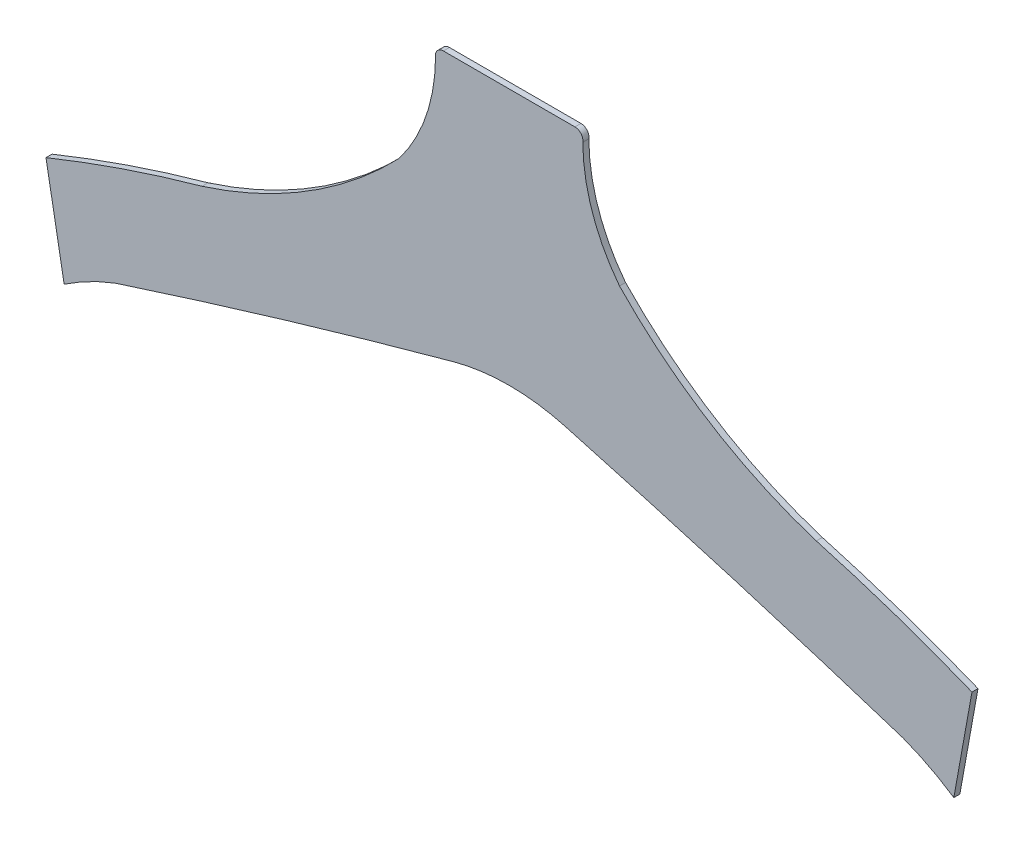
ISO-10303-21;
HEADER;
FILE_DESCRIPTION(('STEP AP214'),'2;1');
FILE_NAME('part.step','',(''),(''),'','','');
FILE_SCHEMA(('AUTOMOTIVE_DESIGN { 1 0 10303 214 1 1 1 1 }'));
ENDSEC;
DATA;
#1=APPLICATION_CONTEXT('core data for automotive mechanical design processes');
#2=APPLICATION_PROTOCOL_DEFINITION('international standard','automotive_design',2000,#1);
#3=PRODUCT_CONTEXT('',#1,'mechanical');
#4=PRODUCT('Part','Part','',(#3));
#5=PRODUCT_RELATED_PRODUCT_CATEGORY('part','',(#4));
#6=PRODUCT_DEFINITION_FORMATION('','',#4);
#7=PRODUCT_DEFINITION_CONTEXT('part definition',#1,'design');
#8=PRODUCT_DEFINITION('design','',#6,#7);
#9=PRODUCT_DEFINITION_SHAPE('','',#8);
#10=(LENGTH_UNIT() NAMED_UNIT(*) SI_UNIT(.MILLI.,.METRE.));
#11=(NAMED_UNIT(*) PLANE_ANGLE_UNIT() SI_UNIT($,.RADIAN.));
#12=(NAMED_UNIT(*) SI_UNIT($,.STERADIAN.) SOLID_ANGLE_UNIT());
#13=UNCERTAINTY_MEASURE_WITH_UNIT(LENGTH_MEASURE(1.E-05),#10,'distance_accuracy_value','');
#14=(GEOMETRIC_REPRESENTATION_CONTEXT(3) GLOBAL_UNCERTAINTY_ASSIGNED_CONTEXT((#13)) GLOBAL_UNIT_ASSIGNED_CONTEXT((#10,
#11,#12)) REPRESENTATION_CONTEXT('',''));
#15=CARTESIAN_POINT('',(0.,0.,0.));
#16=DIRECTION('',(0.,0.,1.));
#17=DIRECTION('',(1.,0.,0.));
#18=AXIS2_PLACEMENT_3D('',#15,#16,#17);
#19=CARTESIAN_POINT('',(-281.954590354069,-637.701637012419,0.));
#20=DIRECTION('',(0.984127859750687,0.177460856705166,0.));
#21=DIRECTION('',(-0.177460856705166,0.984127859750688,0.));
#22=AXIS2_PLACEMENT_3D('',#19,#20,#21);
#23=PLANE('',#22);
#24=DIRECTION('',(-0.177460856705166,0.984127859750688,0.));
#25=VECTOR('',#24,1.);
#26=CARTESIAN_POINT('',(-128.661609224621,-1487.80399893421,0.));
#27=LINE('',#26,#25);
#28=CARTESIAN_POINT('',(-467.870089688117,393.312333342036,0.));
#29=VERTEX_POINT('',#28);
#30=CARTESIAN_POINT('',(-486.947480977291,499.108014753815,0.));
#31=VERTEX_POINT('',#30);
#32=EDGE_CURVE('E237',#29,#31,#27,.T.);
#33=ORIENTED_EDGE('',*,*,#32,.F.);
#34=DIRECTION('',(0.,0.,-1.));
#35=VECTOR('',#34,1.);
#36=CARTESIAN_POINT('',(-467.870089688117,393.312333342036,6.35));
#37=LINE('',#36,#35);
#38=CARTESIAN_POINT('',(-467.870089688117,393.312333342036,6.35));
#39=VERTEX_POINT('',#38);
#40=EDGE_CURVE('E168',#29,#39,#37,.F.);
#41=ORIENTED_EDGE('',*,*,#40,.T.);
#42=DIRECTION('',(-0.177460856705166,0.984127859750688,0.));
#43=VECTOR('',#42,1.);
#44=CARTESIAN_POINT('',(-128.661609224621,-1487.80399893421,6.35));
#45=LINE('',#44,#43);
#46=CARTESIAN_POINT('',(-486.947480977291,499.108014753815,6.35));
#47=VERTEX_POINT('',#46);
#48=EDGE_CURVE('E238',#39,#47,#45,.T.);
#49=ORIENTED_EDGE('',*,*,#48,.T.);
#50=DIRECTION('',(0.,0.,-1.));
#51=VECTOR('',#50,1.);
#52=CARTESIAN_POINT('',(-486.947480977291,499.108014753815,6.35));
#53=LINE('',#52,#51);
#54=EDGE_CURVE('E223',#31,#47,#53,.F.);
#55=ORIENTED_EDGE('',*,*,#54,.F.);
#56=EDGE_LOOP('',(#33,#41,#49,#55));
#57=FACE_BOUND('',#56,.T.);
#58=ADVANCED_FACE('F38',(#57),#23,.F.);
#59=CARTESIAN_POINT('',(281.954590354069,-637.701637012419,0.));
#60=DIRECTION('',(-0.984127859750687,0.177460856705166,0.));
#61=DIRECTION('',(0.177460856705166,0.984127859750688,0.));
#62=AXIS2_PLACEMENT_3D('',#59,#60,#61);
#63=PLANE('',#62);
#64=DIRECTION('',(-0.177460856705166,-0.984127859750688,0.));
#65=VECTOR('',#64,1.);
#66=CARTESIAN_POINT('',(124.848478327971,-1508.95011767804,6.35));
#67=LINE('',#66,#65);
#68=CARTESIAN_POINT('',(486.974549257167,499.258124748981,6.35));
#69=VERTEX_POINT('',#68);
#70=CARTESIAN_POINT('',(467.913163683421,393.55120471681,6.35));
#71=VERTEX_POINT('',#70);
#72=EDGE_CURVE('E42',#69,#71,#67,.T.);
#73=ORIENTED_EDGE('',*,*,#72,.T.);
#74=DIRECTION('',(0.,0.,-1.));
#75=VECTOR('',#74,1.);
#76=CARTESIAN_POINT('',(467.913163683421,393.55120471681,6.35));
#77=LINE('',#76,#75);
#78=CARTESIAN_POINT('',(467.913163683421,393.55120471681,0.));
#79=VERTEX_POINT('',#78);
#80=EDGE_CURVE('E224',#71,#79,#77,.T.);
#81=ORIENTED_EDGE('',*,*,#80,.T.);
#82=DIRECTION('',(-0.177460856705166,-0.984127859750688,0.));
#83=VECTOR('',#82,1.);
#84=CARTESIAN_POINT('',(124.848478327971,-1508.95011767804,0.));
#85=LINE('',#84,#83);
#86=CARTESIAN_POINT('',(486.974549257167,499.258124748981,0.));
#87=VERTEX_POINT('',#86);
#88=EDGE_CURVE('E232',#87,#79,#85,.T.);
#89=ORIENTED_EDGE('',*,*,#88,.F.);
#90=DIRECTION('',(0.,0.,-1.));
#91=VECTOR('',#90,1.);
#92=CARTESIAN_POINT('',(486.974549257167,499.258124748981,6.35));
#93=LINE('',#92,#91);
#94=EDGE_CURVE('E220',#69,#87,#93,.T.);
#95=ORIENTED_EDGE('',*,*,#94,.F.);
#96=EDGE_LOOP('',(#73,#81,#89,#95));
#97=FACE_BOUND('',#96,.T.);
#98=ADVANCED_FACE('F40',(#97),#63,.F.);
#99=CARTESIAN_POINT('',(2011.63115324046,-7049.36280392454,6.35));
#100=DIRECTION('',(0.,0.,-1.));
#101=DIRECTION('',(-1.,0.,0.));
#102=AXIS2_PLACEMENT_3D('',#99,#100,#101);
#103=CYLINDRICAL_SURFACE('',#102,7854.49273987542);
#104=CARTESIAN_POINT('',(2011.63115324046,-7049.36280392454,0.));
#105=DIRECTION('',(0.,0.,1.));
#106=DIRECTION('',(1.,0.,0.));
#107=AXIS2_PLACEMENT_3D('',#104,#105,#106);
#108=CIRCLE('',#107,7854.49273987542);
#109=CARTESIAN_POINT('',(-58.8255058707601,527.329444246666,0.));
#110=VERTEX_POINT('',#109);
#111=CARTESIAN_POINT('',(-413.975366483841,421.212087757254,0.));
#112=VERTEX_POINT('',#111);
#113=EDGE_CURVE('E153',#110,#112,#108,.T.);
#114=ORIENTED_EDGE('',*,*,#113,.F.);
#115=DIRECTION('',(0.,0.,-1.));
#116=VECTOR('',#115,1.);
#117=CARTESIAN_POINT('',(-58.8255058707601,527.329444246666,6.35));
#118=LINE('',#117,#116);
#119=CARTESIAN_POINT('',(-58.8255058707601,527.329444246666,6.35));
#120=VERTEX_POINT('',#119);
#121=EDGE_CURVE('E160',#120,#110,#118,.T.);
#122=ORIENTED_EDGE('',*,*,#121,.F.);
#123=CARTESIAN_POINT('',(2011.63115324046,-7049.36280392454,6.35));
#124=DIRECTION('',(0.,0.,1.));
#125=DIRECTION('',(1.,0.,0.));
#126=AXIS2_PLACEMENT_3D('',#123,#124,#125);
#127=CIRCLE('',#126,7854.49273987542);
#128=CARTESIAN_POINT('',(-413.975366483841,421.212087757254,6.35));
#129=VERTEX_POINT('',#128);
#130=EDGE_CURVE('E156',#120,#129,#127,.T.);
#131=ORIENTED_EDGE('',*,*,#130,.T.);
#132=DIRECTION('',(0.,0.,-1.));
#133=VECTOR('',#132,1.);
#134=CARTESIAN_POINT('',(-413.975366483841,421.212087757254,6.35));
#135=LINE('',#134,#133);
#136=EDGE_CURVE('E149',#129,#112,#135,.T.);
#137=ORIENTED_EDGE('',*,*,#136,.T.);
#138=EDGE_LOOP('',(#114,#122,#131,#137));
#139=FACE_BOUND('',#138,.T.);
#140=ADVANCED_FACE('F151',(#139),#103,.F.);
#141=CARTESIAN_POINT('',(0.0978369199691187,311.703566451883,6.35));
#142=DIRECTION('',(0.,0.,-1.));
#143=DIRECTION('',(-1.,0.,0.));
#144=AXIS2_PLACEMENT_3D('',#141,#142,#143);
#145=CYLINDRICAL_SURFACE('',#144,223.53183106753);
#146=CARTESIAN_POINT('',(0.0978369199691187,311.703566451883,0.));
#147=DIRECTION('',(0.,0.,1.));
#148=DIRECTION('',(1.,0.,0.));
#149=AXIS2_PLACEMENT_3D('',#146,#147,#148);
#150=CIRCLE('',#149,223.53183106753);
#151=CARTESIAN_POINT('',(0.198935808493064,535.23537465693,0.));
#152=VERTEX_POINT('',#151);
#153=EDGE_CURVE('E176',#152,#110,#150,.T.);
#154=ORIENTED_EDGE('',*,*,#153,.F.);
#155=DIRECTION('',(0.,0.,-1.));
#156=VECTOR('',#155,1.);
#157=CARTESIAN_POINT('',(0.198935808493064,535.23537465693,6.35));
#158=LINE('',#157,#156);
#159=CARTESIAN_POINT('',(0.198935808493064,535.23537465693,6.35));
#160=VERTEX_POINT('',#159);
#161=EDGE_CURVE('E188',#160,#152,#158,.T.);
#162=ORIENTED_EDGE('',*,*,#161,.F.);
#163=CARTESIAN_POINT('',(0.0978369199691187,311.703566451883,6.35));
#164=DIRECTION('',(0.,0.,1.));
#165=DIRECTION('',(1.,0.,0.));
#166=AXIS2_PLACEMENT_3D('',#163,#164,#165);
#167=CIRCLE('',#166,223.53183106753);
#168=EDGE_CURVE('E209',#160,#120,#167,.T.);
#169=ORIENTED_EDGE('',*,*,#168,.T.);
#170=ORIENTED_EDGE('',*,*,#121,.T.);
#171=EDGE_LOOP('',(#154,#162,#169,#170));
#172=FACE_BOUND('',#171,.T.);
#173=ADVANCED_FACE('F364',(#172),#145,.F.);
#174=CARTESIAN_POINT('',(0.300034696832263,311.703566451882,6.35));
#175=DIRECTION('',(0.,0.,-1.));
#176=DIRECTION('',(-1.,0.,0.));
#177=AXIS2_PLACEMENT_3D('',#174,#175,#176);
#178=CYLINDRICAL_SURFACE('',#177,223.531831067531);
#179=CARTESIAN_POINT('',(0.300034696832263,311.703566451882,0.));
#180=DIRECTION('',(0.,0.,1.));
#181=DIRECTION('',(1.,0.,0.));
#182=AXIS2_PLACEMENT_3D('',#179,#180,#181);
#183=CIRCLE('',#182,223.531831067531);
#184=CARTESIAN_POINT('',(59.2233774875588,527.329444246667,0.));
#185=VERTEX_POINT('',#184);
#186=EDGE_CURVE('E11',#185,#152,#183,.T.);
#187=ORIENTED_EDGE('',*,*,#186,.F.);
#188=DIRECTION('',(0.,0.,-1.));
#189=VECTOR('',#188,1.);
#190=CARTESIAN_POINT('',(59.2233774875588,527.329444246667,6.35));
#191=LINE('',#190,#189);
#192=CARTESIAN_POINT('',(59.2233774875588,527.329444246667,6.35));
#193=VERTEX_POINT('',#192);
#194=EDGE_CURVE('E57',#193,#185,#191,.T.);
#195=ORIENTED_EDGE('',*,*,#194,.F.);
#196=CARTESIAN_POINT('',(0.300034696832263,311.703566451882,6.35));
#197=DIRECTION('',(0.,0.,1.));
#198=DIRECTION('',(1.,0.,0.));
#199=AXIS2_PLACEMENT_3D('',#196,#197,#198);
#200=CIRCLE('',#199,223.531831067531);
#201=EDGE_CURVE('E217',#193,#160,#200,.T.);
#202=ORIENTED_EDGE('',*,*,#201,.T.);
#203=ORIENTED_EDGE('',*,*,#161,.T.);
#204=EDGE_LOOP('',(#187,#195,#202,#203));
#205=FACE_BOUND('',#204,.T.);
#206=ADVANCED_FACE('F361',(#205),#178,.F.);
#207=CARTESIAN_POINT('',(-2011.23328162366,-7049.36280392454,6.35));
#208=DIRECTION('',(0.,0.,-1.));
#209=DIRECTION('',(-1.,0.,0.));
#210=AXIS2_PLACEMENT_3D('',#207,#208,#209);
#211=CYLINDRICAL_SURFACE('',#210,7854.49273987542);
#212=CARTESIAN_POINT('',(-2011.23328162366,-7049.36280392454,0.));
#213=DIRECTION('',(0.,0.,1.));
#214=DIRECTION('',(1.,0.,0.));
#215=AXIS2_PLACEMENT_3D('',#212,#213,#214);
#216=CIRCLE('',#215,7854.49273987542);
#217=CARTESIAN_POINT('',(414.373238100641,421.212087757253,0.));
#218=VERTEX_POINT('',#217);
#219=EDGE_CURVE('E48',#218,#185,#216,.T.);
#220=ORIENTED_EDGE('',*,*,#219,.F.);
#221=DIRECTION('',(0.,0.,-1.));
#222=VECTOR('',#221,1.);
#223=CARTESIAN_POINT('',(414.373238100641,421.212087757253,6.35));
#224=LINE('',#223,#222);
#225=CARTESIAN_POINT('',(414.373238100641,421.212087757253,6.35));
#226=VERTEX_POINT('',#225);
#227=EDGE_CURVE('E161',#226,#218,#224,.T.);
#228=ORIENTED_EDGE('',*,*,#227,.F.);
#229=CARTESIAN_POINT('',(-2011.23328162366,-7049.36280392454,6.35));
#230=DIRECTION('',(0.,0.,1.));
#231=DIRECTION('',(1.,0.,0.));
#232=AXIS2_PLACEMENT_3D('',#229,#230,#231);
#233=CIRCLE('',#232,7854.49273987542);
#234=EDGE_CURVE('E215',#226,#193,#233,.T.);
#235=ORIENTED_EDGE('',*,*,#234,.T.);
#236=ORIENTED_EDGE('',*,*,#194,.T.);
#237=EDGE_LOOP('',(#220,#228,#235,#236));
#238=FACE_BOUND('',#237,.T.);
#239=ADVANCED_FACE('F260',(#238),#211,.F.);
#240=CARTESIAN_POINT('',(321.271822120409,175.360684015611,6.35));
#241=DIRECTION('',(0.,0.,-1.));
#242=DIRECTION('',(-1.,0.,0.));
#243=AXIS2_PLACEMENT_3D('',#240,#241,#242);
#244=CYLINDRICAL_SURFACE('',#243,262.889304421576);
#245=ORIENTED_EDGE('',*,*,#80,.F.);
#246=CARTESIAN_POINT('',(321.271822120409,175.360684015611,6.35));
#247=DIRECTION('',(0.,0.,1.));
#248=DIRECTION('',(1.,0.,0.));
#249=AXIS2_PLACEMENT_3D('',#246,#247,#248);
#250=CIRCLE('',#249,262.889304421576);
#251=EDGE_CURVE('E103',#71,#226,#250,.T.);
#252=ORIENTED_EDGE('',*,*,#251,.T.);
#253=ORIENTED_EDGE('',*,*,#227,.T.);
#254=CARTESIAN_POINT('',(321.271822120409,175.360684015611,0.));
#255=DIRECTION('',(0.,0.,1.));
#256=DIRECTION('',(1.,0.,0.));
#257=AXIS2_PLACEMENT_3D('',#254,#255,#256);
#258=CIRCLE('',#257,262.889304421576);
#259=EDGE_CURVE('E172',#79,#218,#258,.T.);
#260=ORIENTED_EDGE('',*,*,#259,.F.);
#261=EDGE_LOOP('',(#245,#252,#253,#260));
#262=FACE_BOUND('',#261,.T.);
#263=ADVANCED_FACE('F367',(#262),#244,.F.);
#264=CARTESIAN_POINT('',(-91.7456787835533,-930.835891156297,6.35));
#265=DIRECTION('',(0.,0.,-1.));
#266=DIRECTION('',(-1.,0.,0.));
#267=AXIS2_PLACEMENT_3D('',#264,#265,#266);
#268=CYLINDRICAL_SURFACE('',#267,1542.75273348375);
#269=CARTESIAN_POINT('',(-91.7456787835533,-930.835891156297,6.35));
#270=DIRECTION('',(0.,0.,1.));
#271=DIRECTION('',(1.,0.,0.));
#272=AXIS2_PLACEMENT_3D('',#269,#270,#271);
#273=CIRCLE('',#272,1542.75273348375);
#274=CARTESIAN_POINT('',(323.244028348481,555.054259442346,6.35));
#275=VERTEX_POINT('',#274);
#276=EDGE_CURVE('E208',#69,#275,#273,.T.);
#277=ORIENTED_EDGE('',*,*,#276,.F.);
#278=ORIENTED_EDGE('',*,*,#94,.T.);
#279=CARTESIAN_POINT('',(-91.7456787835533,-930.835891156297,0.));
#280=DIRECTION('',(0.,0.,1.));
#281=DIRECTION('',(1.,0.,0.));
#282=AXIS2_PLACEMENT_3D('',#279,#280,#281);
#283=CIRCLE('',#282,1542.75273348375);
#284=CARTESIAN_POINT('',(323.244028348481,555.054259442346,0.));
#285=VERTEX_POINT('',#284);
#286=EDGE_CURVE('E178',#87,#285,#283,.T.);
#287=ORIENTED_EDGE('',*,*,#286,.T.);
#288=DIRECTION('',(0.,0.,-1.));
#289=VECTOR('',#288,1.);
#290=CARTESIAN_POINT('',(323.244028348481,555.054259442346,6.35));
#291=LINE('',#290,#289);
#292=EDGE_CURVE('E236',#275,#285,#291,.T.);
#293=ORIENTED_EDGE('',*,*,#292,.F.);
#294=EDGE_LOOP('',(#277,#278,#287,#293));
#295=FACE_BOUND('',#294,.T.);
#296=ADVANCED_FACE('F313',(#295),#268,.T.);
#297=CARTESIAN_POINT('',(472.608664898783,1026.06945527542,6.35));
#298=DIRECTION('',(0.,0.,-1.));
#299=DIRECTION('',(-1.,0.,0.));
#300=AXIS2_PLACEMENT_3D('',#297,#298,#299);
#301=CYLINDRICAL_SURFACE('',#300,494.130660207875);
#302=CARTESIAN_POINT('',(472.608664898783,1026.06945527542,0.));
#303=DIRECTION('',(0.,0.,1.));
#304=DIRECTION('',(1.,0.,0.));
#305=AXIS2_PLACEMENT_3D('',#302,#303,#304);
#306=CIRCLE('',#305,494.130660207875);
#307=CARTESIAN_POINT('',(116.254326226602,683.758639397533,0.));
#308=VERTEX_POINT('',#307);
#309=EDGE_CURVE('E230',#308,#285,#306,.T.);
#310=ORIENTED_EDGE('',*,*,#309,.F.);
#311=DIRECTION('',(0.,0.,-1.));
#312=VECTOR('',#311,1.);
#313=CARTESIAN_POINT('',(116.254326226602,683.758639397533,6.35));
#314=LINE('',#313,#312);
#315=CARTESIAN_POINT('',(116.254326226602,683.758639397533,6.35));
#316=VERTEX_POINT('',#315);
#317=EDGE_CURVE('E269',#316,#308,#314,.T.);
#318=ORIENTED_EDGE('',*,*,#317,.F.);
#319=CARTESIAN_POINT('',(472.608664898783,1026.06945527542,6.35));
#320=DIRECTION('',(0.,0.,1.));
#321=DIRECTION('',(1.,0.,0.));
#322=AXIS2_PLACEMENT_3D('',#319,#320,#321);
#323=CIRCLE('',#322,494.130660207875);
#324=EDGE_CURVE('E205',#316,#275,#323,.T.);
#325=ORIENTED_EDGE('',*,*,#324,.T.);
#326=ORIENTED_EDGE('',*,*,#292,.T.);
#327=EDGE_LOOP('',(#310,#318,#325,#326));
#328=FACE_BOUND('',#327,.T.);
#329=ADVANCED_FACE('F309',(#328),#301,.F.);
#330=CARTESIAN_POINT('',(261.678959212676,796.58415880316,6.35));
#331=DIRECTION('',(0.,0.,-1.));
#332=DIRECTION('',(-1.,0.,0.));
#333=AXIS2_PLACEMENT_3D('',#330,#331,#332);
#334=CYLINDRICAL_SURFACE('',#333,184.059560219739);
#335=CARTESIAN_POINT('',(261.678959212676,796.58415880316,0.));
#336=DIRECTION('',(0.,0.,1.));
#337=DIRECTION('',(1.,0.,0.));
#338=AXIS2_PLACEMENT_3D('',#335,#336,#337);
#339=CIRCLE('',#338,184.059560219739);
#340=CARTESIAN_POINT('',(77.6237670810033,795.316106100507,0.));
#341=VERTEX_POINT('',#340);
#342=EDGE_CURVE('E300',#341,#308,#339,.T.);
#343=ORIENTED_EDGE('',*,*,#342,.F.);
#344=DIRECTION('',(0.,0.,-1.));
#345=VECTOR('',#344,1.);
#346=CARTESIAN_POINT('',(77.6237670810033,795.316106100507,6.35));
#347=LINE('',#346,#345);
#348=CARTESIAN_POINT('',(77.6237670810033,795.316106100507,6.35));
#349=VERTEX_POINT('',#348);
#350=EDGE_CURVE('E271',#349,#341,#347,.T.);
#351=ORIENTED_EDGE('',*,*,#350,.F.);
#352=CARTESIAN_POINT('',(261.678959212676,796.58415880316,6.35));
#353=DIRECTION('',(0.,0.,1.));
#354=DIRECTION('',(1.,0.,0.));
#355=AXIS2_PLACEMENT_3D('',#352,#353,#354);
#356=CIRCLE('',#355,184.059560219739);
#357=EDGE_CURVE('E202',#349,#316,#356,.T.);
#358=ORIENTED_EDGE('',*,*,#357,.T.);
#359=ORIENTED_EDGE('',*,*,#317,.T.);
#360=EDGE_LOOP('',(#343,#351,#358,#359));
#361=FACE_BOUND('',#360,.T.);
#362=ADVANCED_FACE('F345',(#361),#334,.F.);
#363=CARTESIAN_POINT('',(69.3852199630136,796.862619334221,6.35));
#364=DIRECTION('',(0.,0.,-1.));
#365=DIRECTION('',(-1.,0.,0.));
#366=AXIS2_PLACEMENT_3D('',#363,#364,#365);
#367=CYLINDRICAL_SURFACE('',#366,8.38244366502914);
#368=CARTESIAN_POINT('',(69.3852199630136,796.862619334221,0.));
#369=DIRECTION('',(0.,0.,1.));
#370=DIRECTION('',(1.,0.,0.));
#371=AXIS2_PLACEMENT_3D('',#368,#369,#370);
#372=CIRCLE('',#371,8.38244366502914);
#373=CARTESIAN_POINT('',(69.3852199630127,805.24506299925,0.));
#374=VERTEX_POINT('',#373);
#375=EDGE_CURVE('E297',#341,#374,#372,.T.);
#376=ORIENTED_EDGE('',*,*,#375,.T.);
#377=DIRECTION('',(0.,0.,-1.));
#378=VECTOR('',#377,1.);
#379=CARTESIAN_POINT('',(69.3852199630127,805.24506299925,6.35));
#380=LINE('',#379,#378);
#381=CARTESIAN_POINT('',(69.3852199630127,805.24506299925,6.35));
#382=VERTEX_POINT('',#381);
#383=EDGE_CURVE('E273',#382,#374,#380,.T.);
#384=ORIENTED_EDGE('',*,*,#383,.F.);
#385=CARTESIAN_POINT('',(69.3852199630136,796.862619334221,6.35));
#386=DIRECTION('',(0.,0.,1.));
#387=DIRECTION('',(1.,0.,0.));
#388=AXIS2_PLACEMENT_3D('',#385,#386,#387);
#389=CIRCLE('',#388,8.38244366502914);
#390=EDGE_CURVE('E199',#349,#382,#389,.T.);
#391=ORIENTED_EDGE('',*,*,#390,.F.);
#392=ORIENTED_EDGE('',*,*,#350,.T.);
#393=EDGE_LOOP('',(#376,#384,#391,#392));
#394=FACE_BOUND('',#393,.T.);
#395=ADVANCED_FACE('F343',(#394),#367,.T.);
#396=CARTESIAN_POINT('',(-60.5405790775313,805.245062999249,6.35));
#397=DIRECTION('',(0.,-1.,0.));
#398=DIRECTION('',(1.,0.,0.));
#399=AXIS2_PLACEMENT_3D('',#396,#397,#398);
#400=PLANE('',#399);
#401=DIRECTION('',(-1.,0.,0.));
#402=VECTOR('',#401,1.);
#403=CARTESIAN_POINT('',(-60.5405790775313,805.245062999249,0.));
#404=LINE('',#403,#402);
#405=CARTESIAN_POINT('',(-68.9873483461652,805.24506299925,0.));
#406=VERTEX_POINT('',#405);
#407=EDGE_CURVE('E294',#374,#406,#404,.T.);
#408=ORIENTED_EDGE('',*,*,#407,.T.);
#409=DIRECTION('',(0.,0.,-1.));
#410=VECTOR('',#409,1.);
#411=CARTESIAN_POINT('',(-68.9873483461652,805.24506299925,6.35));
#412=LINE('',#411,#410);
#413=CARTESIAN_POINT('',(-68.9873483461652,805.24506299925,6.35));
#414=VERTEX_POINT('',#413);
#415=EDGE_CURVE('E276',#414,#406,#412,.T.);
#416=ORIENTED_EDGE('',*,*,#415,.F.);
#417=DIRECTION('',(-1.,0.,0.));
#418=VECTOR('',#417,1.);
#419=CARTESIAN_POINT('',(-60.5405790775313,805.245062999249,6.35));
#420=LINE('',#419,#418);
#421=EDGE_CURVE('E196',#382,#414,#420,.T.);
#422=ORIENTED_EDGE('',*,*,#421,.F.);
#423=ORIENTED_EDGE('',*,*,#383,.T.);
#424=EDGE_LOOP('',(#408,#416,#422,#423));
#425=FACE_BOUND('',#424,.T.);
#426=ADVANCED_FACE('F339',(#425),#400,.F.);
#427=CARTESIAN_POINT('',(-68.9873483461643,796.862619334221,6.35));
#428=DIRECTION('',(0.,0.,-1.));
#429=DIRECTION('',(-1.,0.,0.));
#430=AXIS2_PLACEMENT_3D('',#427,#428,#429);
#431=CYLINDRICAL_SURFACE('',#430,8.38244366502845);
#432=CARTESIAN_POINT('',(-68.9873483461643,796.862619334221,0.));
#433=DIRECTION('',(0.,0.,1.));
#434=DIRECTION('',(1.,0.,0.));
#435=AXIS2_PLACEMENT_3D('',#432,#433,#434);
#436=CIRCLE('',#435,8.38244366502845);
#437=CARTESIAN_POINT('',(-77.2258954641533,795.316106100508,0.));
#438=VERTEX_POINT('',#437);
#439=EDGE_CURVE('E291',#406,#438,#436,.T.);
#440=ORIENTED_EDGE('',*,*,#439,.T.);
#441=DIRECTION('',(0.,0.,-1.));
#442=VECTOR('',#441,1.);
#443=CARTESIAN_POINT('',(-77.2258954641533,795.316106100508,6.35));
#444=LINE('',#443,#442);
#445=CARTESIAN_POINT('',(-77.2258954641533,795.316106100508,6.35));
#446=VERTEX_POINT('',#445);
#447=EDGE_CURVE('E279',#446,#438,#444,.T.);
#448=ORIENTED_EDGE('',*,*,#447,.F.);
#449=CARTESIAN_POINT('',(-68.9873483461643,796.862619334221,6.35));
#450=DIRECTION('',(0.,0.,1.));
#451=DIRECTION('',(1.,0.,0.));
#452=AXIS2_PLACEMENT_3D('',#449,#450,#451);
#453=CIRCLE('',#452,8.38244366502845);
#454=EDGE_CURVE('E194',#414,#446,#453,.T.);
#455=ORIENTED_EDGE('',*,*,#454,.F.);
#456=ORIENTED_EDGE('',*,*,#415,.T.);
#457=EDGE_LOOP('',(#440,#448,#455,#456));
#458=FACE_BOUND('',#457,.T.);
#459=ADVANCED_FACE('F337',(#458),#431,.T.);
#460=CARTESIAN_POINT('',(-261.281087595827,796.584158803159,6.35));
#461=DIRECTION('',(0.,0.,-1.));
#462=DIRECTION('',(-1.,0.,0.));
#463=AXIS2_PLACEMENT_3D('',#460,#461,#462);
#464=CYLINDRICAL_SURFACE('',#463,184.05956021974);
#465=CARTESIAN_POINT('',(-261.281087595827,796.584158803159,0.));
#466=DIRECTION('',(0.,0.,1.));
#467=DIRECTION('',(1.,0.,0.));
#468=AXIS2_PLACEMENT_3D('',#465,#466,#467);
#469=CIRCLE('',#468,184.05956021974);
#470=CARTESIAN_POINT('',(-115.856454609833,683.758639397429,0.));
#471=VERTEX_POINT('',#470);
#472=EDGE_CURVE('E288',#471,#438,#469,.T.);
#473=ORIENTED_EDGE('',*,*,#472,.F.);
#474=DIRECTION('',(0.,0.,-1.));
#475=VECTOR('',#474,1.);
#476=CARTESIAN_POINT('',(-115.856454609833,683.758639397429,6.35));
#477=LINE('',#476,#475);
#478=CARTESIAN_POINT('',(-115.856454609833,683.758639397429,6.35));
#479=VERTEX_POINT('',#478);
#480=EDGE_CURVE('E281',#479,#471,#477,.T.);
#481=ORIENTED_EDGE('',*,*,#480,.F.);
#482=CARTESIAN_POINT('',(-261.281087595827,796.584158803159,6.35));
#483=DIRECTION('',(0.,0.,1.));
#484=DIRECTION('',(1.,0.,0.));
#485=AXIS2_PLACEMENT_3D('',#482,#483,#484);
#486=CIRCLE('',#485,184.05956021974);
#487=EDGE_CURVE('E191',#479,#446,#486,.T.);
#488=ORIENTED_EDGE('',*,*,#487,.T.);
#489=ORIENTED_EDGE('',*,*,#447,.T.);
#490=EDGE_LOOP('',(#473,#481,#488,#489));
#491=FACE_BOUND('',#490,.T.);
#492=ADVANCED_FACE('F333',(#491),#464,.F.);
#493=CARTESIAN_POINT('',(-472.210793281934,1026.06945527542,6.35));
#494=DIRECTION('',(0.,0.,-1.));
#495=DIRECTION('',(-1.,0.,0.));
#496=AXIS2_PLACEMENT_3D('',#493,#494,#495);
#497=CYLINDRICAL_SURFACE('',#496,494.13066020789);
#498=CARTESIAN_POINT('',(-472.210793281934,1026.06945527542,0.));
#499=DIRECTION('',(0.,0.,1.));
#500=DIRECTION('',(1.,0.,0.));
#501=AXIS2_PLACEMENT_3D('',#498,#499,#500);
#502=CIRCLE('',#501,494.13066020789);
#503=CARTESIAN_POINT('',(-322.846156731626,555.054259442333,0.));
#504=VERTEX_POINT('',#503);
#505=EDGE_CURVE('E285',#504,#471,#502,.T.);
#506=ORIENTED_EDGE('',*,*,#505,.F.);
#507=DIRECTION('',(0.,0.,-1.));
#508=VECTOR('',#507,1.);
#509=CARTESIAN_POINT('',(-322.846156731626,555.054259442333,6.35));
#510=LINE('',#509,#508);
#511=CARTESIAN_POINT('',(-322.846156731626,555.054259442333,6.35));
#512=VERTEX_POINT('',#511);
#513=EDGE_CURVE('E115',#512,#504,#510,.T.);
#514=ORIENTED_EDGE('',*,*,#513,.F.);
#515=CARTESIAN_POINT('',(-472.210793281934,1026.06945527542,6.35));
#516=DIRECTION('',(0.,0.,1.));
#517=DIRECTION('',(1.,0.,0.));
#518=AXIS2_PLACEMENT_3D('',#515,#516,#517);
#519=CIRCLE('',#518,494.13066020789);
#520=EDGE_CURVE('E187',#512,#479,#519,.T.);
#521=ORIENTED_EDGE('',*,*,#520,.T.);
#522=ORIENTED_EDGE('',*,*,#480,.T.);
#523=EDGE_LOOP('',(#506,#514,#521,#522));
#524=FACE_BOUND('',#523,.T.);
#525=ADVANCED_FACE('F329',(#524),#497,.F.);
#526=CARTESIAN_POINT('',(92.1435504004071,-930.835891156311,6.35));
#527=DIRECTION('',(0.,0.,-1.));
#528=DIRECTION('',(-1.,0.,0.));
#529=AXIS2_PLACEMENT_3D('',#526,#527,#528);
#530=CYLINDRICAL_SURFACE('',#529,1542.75273348375);
#531=CARTESIAN_POINT('',(92.1435504004071,-930.835891156311,0.));
#532=DIRECTION('',(0.,0.,1.));
#533=DIRECTION('',(1.,0.,0.));
#534=AXIS2_PLACEMENT_3D('',#531,#532,#533);
#535=CIRCLE('',#534,1542.75273348375);
#536=EDGE_CURVE('E219',#504,#31,#535,.T.);
#537=ORIENTED_EDGE('',*,*,#536,.T.);
#538=ORIENTED_EDGE('',*,*,#54,.T.);
#539=CARTESIAN_POINT('',(92.1435504004071,-930.835891156311,6.35));
#540=DIRECTION('',(0.,0.,1.));
#541=DIRECTION('',(1.,0.,0.));
#542=AXIS2_PLACEMENT_3D('',#539,#540,#541);
#543=CIRCLE('',#542,1542.75273348375);
#544=EDGE_CURVE('E184',#512,#47,#543,.T.);
#545=ORIENTED_EDGE('',*,*,#544,.F.);
#546=ORIENTED_EDGE('',*,*,#513,.T.);
#547=EDGE_LOOP('',(#537,#538,#545,#546));
#548=FACE_BOUND('',#547,.T.);
#549=ADVANCED_FACE('F326',(#548),#530,.T.);
#550=CARTESIAN_POINT('',(-320.873950503608,175.360684015611,6.35));
#551=DIRECTION('',(0.,0.,-1.));
#552=DIRECTION('',(-1.,0.,0.));
#553=AXIS2_PLACEMENT_3D('',#550,#551,#552);
#554=CYLINDRICAL_SURFACE('',#553,262.889304421577);
#555=ORIENTED_EDGE('',*,*,#40,.F.);
#556=CARTESIAN_POINT('',(-320.873950503608,175.360684015611,0.));
#557=DIRECTION('',(0.,0.,1.));
#558=DIRECTION('',(1.,0.,0.));
#559=AXIS2_PLACEMENT_3D('',#556,#557,#558);
#560=CIRCLE('',#559,262.889304421577);
#561=EDGE_CURVE('E165',#112,#29,#560,.T.);
#562=ORIENTED_EDGE('',*,*,#561,.F.);
#563=ORIENTED_EDGE('',*,*,#136,.F.);
#564=CARTESIAN_POINT('',(-320.873950503608,175.360684015611,6.35));
#565=DIRECTION('',(0.,0.,1.));
#566=DIRECTION('',(1.,0.,0.));
#567=AXIS2_PLACEMENT_3D('',#564,#565,#566);
#568=CIRCLE('',#567,262.889304421577);
#569=EDGE_CURVE('E213',#129,#39,#568,.T.);
#570=ORIENTED_EDGE('',*,*,#569,.T.);
#571=EDGE_LOOP('',(#555,#562,#563,#570));
#572=FACE_BOUND('',#571,.T.);
#573=ADVANCED_FACE('F166',(#572),#554,.F.);
#574=CARTESIAN_POINT('',(-60.5405790775166,-1475.52021258494,0.));
#575=DIRECTION('',(0.,0.,1.));
#576=DIRECTION('',(1.,0.,0.));
#577=AXIS2_PLACEMENT_3D('',#574,#575,#576);
#578=PLANE('',#577);
#579=ORIENTED_EDGE('',*,*,#561,.T.);
#580=ORIENTED_EDGE('',*,*,#32,.T.);
#581=ORIENTED_EDGE('',*,*,#536,.F.);
#582=ORIENTED_EDGE('',*,*,#505,.T.);
#583=ORIENTED_EDGE('',*,*,#472,.T.);
#584=ORIENTED_EDGE('',*,*,#439,.F.);
#585=ORIENTED_EDGE('',*,*,#407,.F.);
#586=ORIENTED_EDGE('',*,*,#375,.F.);
#587=ORIENTED_EDGE('',*,*,#342,.T.);
#588=ORIENTED_EDGE('',*,*,#309,.T.);
#589=ORIENTED_EDGE('',*,*,#286,.F.);
#590=ORIENTED_EDGE('',*,*,#88,.T.);
#591=ORIENTED_EDGE('',*,*,#259,.T.);
#592=ORIENTED_EDGE('',*,*,#219,.T.);
#593=ORIENTED_EDGE('',*,*,#186,.T.);
#594=ORIENTED_EDGE('',*,*,#153,.T.);
#595=ORIENTED_EDGE('',*,*,#113,.T.);
#596=EDGE_LOOP('',(#579,#580,#581,#582,#583,#584,#585,#586,#587,#588,#589,#590,#591,#592,#593,
#594,#595));
#597=FACE_BOUND('',#596,.T.);
#598=ADVANCED_FACE('F174',(#597),#578,.F.);
#599=CARTESIAN_POINT('',(-60.5405790775166,-1475.52021258494,6.35));
#600=DIRECTION('',(0.,0.,1.));
#601=DIRECTION('',(1.,0.,0.));
#602=AXIS2_PLACEMENT_3D('',#599,#600,#601);
#603=PLANE('',#602);
#604=ORIENTED_EDGE('',*,*,#48,.F.);
#605=ORIENTED_EDGE('',*,*,#569,.F.);
#606=ORIENTED_EDGE('',*,*,#130,.F.);
#607=ORIENTED_EDGE('',*,*,#168,.F.);
#608=ORIENTED_EDGE('',*,*,#201,.F.);
#609=ORIENTED_EDGE('',*,*,#234,.F.);
#610=ORIENTED_EDGE('',*,*,#251,.F.);
#611=ORIENTED_EDGE('',*,*,#72,.F.);
#612=ORIENTED_EDGE('',*,*,#276,.T.);
#613=ORIENTED_EDGE('',*,*,#324,.F.);
#614=ORIENTED_EDGE('',*,*,#357,.F.);
#615=ORIENTED_EDGE('',*,*,#390,.T.);
#616=ORIENTED_EDGE('',*,*,#421,.T.);
#617=ORIENTED_EDGE('',*,*,#454,.T.);
#618=ORIENTED_EDGE('',*,*,#487,.F.);
#619=ORIENTED_EDGE('',*,*,#520,.F.);
#620=ORIENTED_EDGE('',*,*,#544,.T.);
#621=EDGE_LOOP('',(#604,#605,#606,#607,#608,#609,#610,#611,#612,#613,#614,#615,#616,#617,#618,
#619,#620));
#622=FACE_BOUND('',#621,.T.);
#623=ADVANCED_FACE('F258',(#622),#603,.T.);
#624=CLOSED_SHELL('',(#58,#98,#140,#173,#206,#239,#263,#296,#329,#362,#395,#426,#459,#492,#525,
#549,#573,#598,#623));
#625=MANIFOLD_SOLID_BREP('B2',#624);
#626=ADVANCED_BREP_SHAPE_REPRESENTATION('',(#18,#625),#14);
#627=SHAPE_DEFINITION_REPRESENTATION(#9,#626);
ENDSEC;
END-ISO-10303-21;
